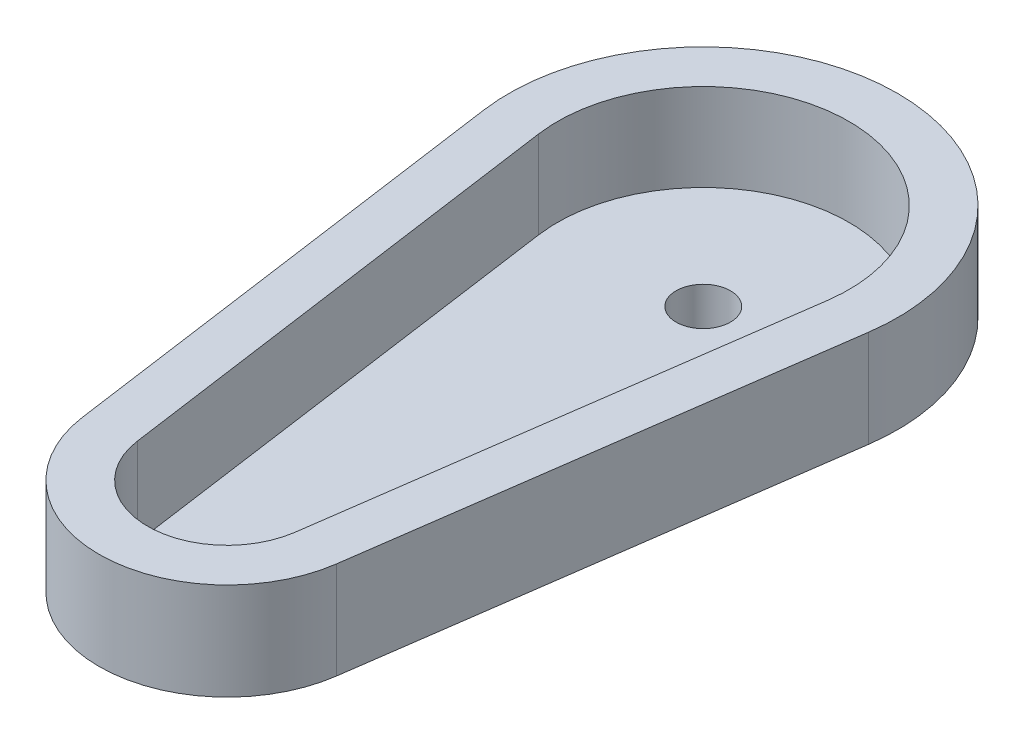
ISO-10303-21;
HEADER;
FILE_DESCRIPTION(('STEP AP214'),'2;1');
FILE_NAME('part.step','',(''),(''),'','','');
FILE_SCHEMA(('AUTOMOTIVE_DESIGN { 1 0 10303 214 1 1 1 1 }'));
ENDSEC;
DATA;
#1=APPLICATION_CONTEXT('core data for automotive mechanical design processes');
#2=APPLICATION_PROTOCOL_DEFINITION('international standard','automotive_design',2000,#1);
#3=PRODUCT_CONTEXT('',#1,'mechanical');
#4=PRODUCT('Part','Part','',(#3));
#5=PRODUCT_RELATED_PRODUCT_CATEGORY('part','',(#4));
#6=PRODUCT_DEFINITION_FORMATION('','',#4);
#7=PRODUCT_DEFINITION_CONTEXT('part definition',#1,'design');
#8=PRODUCT_DEFINITION('design','',#6,#7);
#9=PRODUCT_DEFINITION_SHAPE('','',#8);
#10=(LENGTH_UNIT() NAMED_UNIT(*) SI_UNIT(.MILLI.,.METRE.));
#11=(NAMED_UNIT(*) PLANE_ANGLE_UNIT() SI_UNIT($,.RADIAN.));
#12=(NAMED_UNIT(*) SI_UNIT($,.STERADIAN.) SOLID_ANGLE_UNIT());
#13=UNCERTAINTY_MEASURE_WITH_UNIT(LENGTH_MEASURE(1.E-05),#10,'distance_accuracy_value','');
#14=(GEOMETRIC_REPRESENTATION_CONTEXT(3) GLOBAL_UNCERTAINTY_ASSIGNED_CONTEXT((#13)) GLOBAL_UNIT_ASSIGNED_CONTEXT((#10,
#11,#12)) REPRESENTATION_CONTEXT('',''));
#15=CARTESIAN_POINT('',(0.,0.,0.));
#16=DIRECTION('',(0.,0.,1.));
#17=DIRECTION('',(1.,0.,0.));
#18=AXIS2_PLACEMENT_3D('',#15,#16,#17);
#19=CARTESIAN_POINT('',(0.,2.5,0.));
#20=DIRECTION('',(0.,-1.,0.));
#21=DIRECTION('',(0.,0.,-1.));
#22=AXIS2_PLACEMENT_3D('',#19,#20,#21);
#23=PLANE('',#22);
#24=CARTESIAN_POINT('',(0.,2.5,0.));
#25=DIRECTION('',(0.,1.,0.));
#26=DIRECTION('',(0.,0.,1.));
#27=AXIS2_PLACEMENT_3D('',#24,#25,#26);
#28=CIRCLE('',#27,1.4);
#29=CARTESIAN_POINT('',(0.,2.5,1.4));
#30=VERTEX_POINT('',#29);
#31=EDGE_CURVE('E157',#30,#30,#28,.T.);
#32=ORIENTED_EDGE('',*,*,#31,.F.);
#33=EDGE_LOOP('',(#32));
#34=FACE_BOUND('',#33,.T.);
#35=CARTESIAN_POINT('',(0.,2.5,24.5));
#36=DIRECTION('',(0.,1.,0.));
#37=DIRECTION('',(0.,0.,1.));
#38=AXIS2_PLACEMENT_3D('',#35,#36,#37);
#39=CIRCLE('',#38,1.4);
#40=CARTESIAN_POINT('',(0.,2.5,25.9));
#41=VERTEX_POINT('',#40);
#42=EDGE_CURVE('E160',#41,#41,#39,.T.);
#43=ORIENTED_EDGE('',*,*,#42,.F.);
#44=EDGE_LOOP('',(#43));
#45=FACE_BOUND('',#44,.T.);
#46=CARTESIAN_POINT('',(0.,2.5,0.));
#47=DIRECTION('',(0.,1.,0.));
#48=DIRECTION('',(0.,0.,-1.));
#49=AXIS2_PLACEMENT_3D('',#46,#47,#48);
#50=CIRCLE('',#49,7.5);
#51=CARTESIAN_POINT('',(7.42742898817803,2.5,1.04081632653061));
#52=VERTEX_POINT('',#51);
#53=CARTESIAN_POINT('',(-7.42742898817803,2.5,1.04081632653061));
#54=VERTEX_POINT('',#53);
#55=EDGE_CURVE('E132',#52,#54,#50,.T.);
#56=ORIENTED_EDGE('',*,*,#55,.T.);
#57=DIRECTION('',(0.138775510204082,0.,0.990323865090404));
#58=VECTOR('',#57,1.);
#59=CARTESIAN_POINT('',(-7.42742898817803,2.5,1.04081632653061));
#60=LINE('',#59,#58);
#61=CARTESIAN_POINT('',(-4.06032784687066,2.5,25.0689795918367));
#62=VERTEX_POINT('',#61);
#63=EDGE_CURVE('E207',#54,#62,#60,.T.);
#64=ORIENTED_EDGE('',*,*,#63,.T.);
#65=CARTESIAN_POINT('',(0.,2.5,24.5));
#66=DIRECTION('',(0.,1.,0.));
#67=DIRECTION('',(0.,0.,1.));
#68=AXIS2_PLACEMENT_3D('',#65,#66,#67);
#69=CIRCLE('',#68,4.1);
#70=CARTESIAN_POINT('',(4.06032784687066,2.5,25.0689795918367));
#71=VERTEX_POINT('',#70);
#72=EDGE_CURVE('E211',#62,#71,#69,.T.);
#73=ORIENTED_EDGE('',*,*,#72,.T.);
#74=DIRECTION('',(0.138775510204082,0.,-0.990323865090404));
#75=VECTOR('',#74,1.);
#76=CARTESIAN_POINT('',(7.42742898817803,2.5,1.04081632653061));
#77=LINE('',#76,#75);
#78=EDGE_CURVE('E215',#71,#52,#77,.T.);
#79=ORIENTED_EDGE('',*,*,#78,.T.);
#80=EDGE_LOOP('',(#56,#64,#73,#79));
#81=FACE_BOUND('',#80,.T.);
#82=ADVANCED_FACE('F45',(#34,#45,#81),#23,.F.);
#83=CARTESIAN_POINT('',(0.,7.,0.));
#84=DIRECTION('',(0.,-1.,0.));
#85=DIRECTION('',(0.,0.,-1.));
#86=AXIS2_PLACEMENT_3D('',#83,#84,#85);
#87=CYLINDRICAL_SURFACE('',#86,7.5);
#88=DIRECTION('',(0.,-1.,0.));
#89=VECTOR('',#88,1.);
#90=CARTESIAN_POINT('',(-7.42742898817803,7.,1.04081632653061));
#91=LINE('',#90,#89);
#92=CARTESIAN_POINT('',(-7.42742898817803,7.,1.04081632653061));
#93=VERTEX_POINT('',#92);
#94=EDGE_CURVE('E167',#93,#54,#91,.T.);
#95=ORIENTED_EDGE('',*,*,#94,.T.);
#96=ORIENTED_EDGE('',*,*,#55,.F.);
#97=DIRECTION('',(0.,-1.,0.));
#98=VECTOR('',#97,1.);
#99=CARTESIAN_POINT('',(7.42742898817803,7.,1.04081632653061));
#100=LINE('',#99,#98);
#101=CARTESIAN_POINT('',(7.42742898817803,7.,1.04081632653061));
#102=VERTEX_POINT('',#101);
#103=EDGE_CURVE('E124',#102,#52,#100,.T.);
#104=ORIENTED_EDGE('',*,*,#103,.F.);
#105=CARTESIAN_POINT('',(0.,7.,0.));
#106=DIRECTION('',(0.,-1.,0.));
#107=DIRECTION('',(0.,0.,-1.));
#108=AXIS2_PLACEMENT_3D('',#105,#106,#107);
#109=CIRCLE('',#108,7.5);
#110=EDGE_CURVE('E129',#93,#102,#109,.T.);
#111=ORIENTED_EDGE('',*,*,#110,.F.);
#112=EDGE_LOOP('',(#95,#96,#104,#111));
#113=FACE_BOUND('',#112,.T.);
#114=ADVANCED_FACE('F127',(#113),#87,.F.);
#115=CARTESIAN_POINT('',(-7.42742898817803,7.,1.04081632653061));
#116=DIRECTION('',(-0.990323865090404,0.,0.138775510204082));
#117=DIRECTION('',(0.138775510204082,0.,0.990323865090404));
#118=AXIS2_PLACEMENT_3D('',#115,#116,#117);
#119=PLANE('',#118);
#120=DIRECTION('',(0.,-1.,0.));
#121=VECTOR('',#120,1.);
#122=CARTESIAN_POINT('',(-4.06032784687066,7.,25.0689795918367));
#123=LINE('',#122,#121);
#124=CARTESIAN_POINT('',(-4.06032784687066,7.,25.0689795918367));
#125=VERTEX_POINT('',#124);
#126=EDGE_CURVE('E171',#125,#62,#123,.T.);
#127=ORIENTED_EDGE('',*,*,#126,.T.);
#128=ORIENTED_EDGE('',*,*,#63,.F.);
#129=ORIENTED_EDGE('',*,*,#94,.F.);
#130=DIRECTION('',(-0.138775510204082,0.,-0.990323865090404));
#131=VECTOR('',#130,1.);
#132=CARTESIAN_POINT('',(-7.42742898817803,7.,1.04081632653061));
#133=LINE('',#132,#131);
#134=EDGE_CURVE('E137',#125,#93,#133,.T.);
#135=ORIENTED_EDGE('',*,*,#134,.F.);
#136=EDGE_LOOP('',(#127,#128,#129,#135));
#137=FACE_BOUND('',#136,.T.);
#138=ADVANCED_FACE('F280',(#137),#119,.F.);
#139=CARTESIAN_POINT('',(0.,7.,24.5));
#140=DIRECTION('',(0.,-1.,0.));
#141=DIRECTION('',(0.,0.,-1.));
#142=AXIS2_PLACEMENT_3D('',#139,#140,#141);
#143=CYLINDRICAL_SURFACE('',#142,4.1);
#144=DIRECTION('',(0.,-1.,0.));
#145=VECTOR('',#144,1.);
#146=CARTESIAN_POINT('',(4.06032784687066,7.,25.0689795918367));
#147=LINE('',#146,#145);
#148=CARTESIAN_POINT('',(4.06032784687066,7.,25.0689795918367));
#149=VERTEX_POINT('',#148);
#150=EDGE_CURVE('E136',#149,#71,#147,.T.);
#151=ORIENTED_EDGE('',*,*,#150,.T.);
#152=ORIENTED_EDGE('',*,*,#72,.F.);
#153=ORIENTED_EDGE('',*,*,#126,.F.);
#154=CARTESIAN_POINT('',(0.,7.,24.5));
#155=DIRECTION('',(0.,-1.,0.));
#156=DIRECTION('',(0.,0.,-1.));
#157=AXIS2_PLACEMENT_3D('',#154,#155,#156);
#158=CIRCLE('',#157,4.1);
#159=EDGE_CURVE('E147',#149,#125,#158,.T.);
#160=ORIENTED_EDGE('',*,*,#159,.F.);
#161=EDGE_LOOP('',(#151,#152,#153,#160));
#162=FACE_BOUND('',#161,.T.);
#163=ADVANCED_FACE('F278',(#162),#143,.F.);
#164=CARTESIAN_POINT('',(4.06032784687066,7.,25.0689795918367));
#165=DIRECTION('',(0.990323865090404,0.,0.138775510204082));
#166=DIRECTION('',(0.138775510204082,0.,-0.990323865090404));
#167=AXIS2_PLACEMENT_3D('',#164,#165,#166);
#168=PLANE('',#167);
#169=ORIENTED_EDGE('',*,*,#103,.T.);
#170=ORIENTED_EDGE('',*,*,#78,.F.);
#171=ORIENTED_EDGE('',*,*,#150,.F.);
#172=DIRECTION('',(-0.138775510204082,0.,0.990323865090404));
#173=VECTOR('',#172,1.);
#174=CARTESIAN_POINT('',(4.06032784687066,7.,25.0689795918367));
#175=LINE('',#174,#173);
#176=EDGE_CURVE('E141',#102,#149,#175,.T.);
#177=ORIENTED_EDGE('',*,*,#176,.F.);
#178=EDGE_LOOP('',(#169,#170,#171,#177));
#179=FACE_BOUND('',#178,.T.);
#180=ADVANCED_FACE('F142',(#179),#168,.F.);
#181=CARTESIAN_POINT('',(0.,7.,0.));
#182=DIRECTION('',(0.,-1.,0.));
#183=DIRECTION('',(0.,0.,-1.));
#184=AXIS2_PLACEMENT_3D('',#181,#182,#183);
#185=CYLINDRICAL_SURFACE('',#184,10.);
#186=DIRECTION('',(0.,-1.,0.));
#187=VECTOR('',#186,1.);
#188=CARTESIAN_POINT('',(9.90323865090404,7.,1.38775510204081));
#189=LINE('',#188,#187);
#190=CARTESIAN_POINT('',(9.90323865090404,7.,1.38775510204081));
#191=VERTEX_POINT('',#190);
#192=CARTESIAN_POINT('',(9.90323865090404,2.,1.38775510204081));
#193=VERTEX_POINT('',#192);
#194=EDGE_CURVE('E192',#191,#193,#189,.T.);
#195=ORIENTED_EDGE('',*,*,#194,.T.);
#196=CARTESIAN_POINT('',(0.,2.,0.));
#197=DIRECTION('',(0.,-1.,0.));
#198=DIRECTION('',(0.,0.,-1.));
#199=AXIS2_PLACEMENT_3D('',#196,#197,#198);
#200=CIRCLE('',#199,10.);
#201=CARTESIAN_POINT('',(-9.90323865090404,2.,1.38775510204082));
#202=VERTEX_POINT('',#201);
#203=EDGE_CURVE('E11',#193,#202,#200,.F.);
#204=ORIENTED_EDGE('',*,*,#203,.T.);
#205=DIRECTION('',(0.,-1.,0.));
#206=VECTOR('',#205,1.);
#207=CARTESIAN_POINT('',(-9.90323865090404,7.,1.38775510204082));
#208=LINE('',#207,#206);
#209=CARTESIAN_POINT('',(-9.90323865090404,7.,1.38775510204082));
#210=VERTEX_POINT('',#209);
#211=EDGE_CURVE('E193',#210,#202,#208,.T.);
#212=ORIENTED_EDGE('',*,*,#211,.F.);
#213=CARTESIAN_POINT('',(0.,7.,0.));
#214=DIRECTION('',(0.,-1.,0.));
#215=DIRECTION('',(0.,0.,-1.));
#216=AXIS2_PLACEMENT_3D('',#213,#214,#215);
#217=CIRCLE('',#216,10.);
#218=EDGE_CURVE('E170',#210,#191,#217,.T.);
#219=ORIENTED_EDGE('',*,*,#218,.T.);
#220=EDGE_LOOP('',(#195,#204,#212,#219));
#221=FACE_BOUND('',#220,.T.);
#222=ADVANCED_FACE('F294',(#221),#185,.T.);
#223=CARTESIAN_POINT('',(-6.53613750959667,7.,25.4159183673469));
#224=DIRECTION('',(-0.990323865090404,0.,0.138775510204082));
#225=DIRECTION('',(0.138775510204082,0.,0.990323865090404));
#226=AXIS2_PLACEMENT_3D('',#223,#224,#225);
#227=PLANE('',#226);
#228=ORIENTED_EDGE('',*,*,#211,.T.);
#229=DIRECTION('',(0.138775510204082,0.,0.990323865090404));
#230=VECTOR('',#229,1.);
#231=CARTESIAN_POINT('',(-6.53613750959667,2.,25.4159183673469));
#232=LINE('',#231,#230);
#233=CARTESIAN_POINT('',(-6.53613750959667,2.,25.4159183673469));
#234=VERTEX_POINT('',#233);
#235=EDGE_CURVE('E235',#202,#234,#232,.T.);
#236=ORIENTED_EDGE('',*,*,#235,.T.);
#237=DIRECTION('',(0.,-1.,0.));
#238=VECTOR('',#237,1.);
#239=CARTESIAN_POINT('',(-6.53613750959667,7.,25.4159183673469));
#240=LINE('',#239,#238);
#241=CARTESIAN_POINT('',(-6.53613750959667,7.,25.4159183673469));
#242=VERTEX_POINT('',#241);
#243=EDGE_CURVE('E196',#242,#234,#240,.T.);
#244=ORIENTED_EDGE('',*,*,#243,.F.);
#245=DIRECTION('',(-0.138775510204082,0.,-0.990323865090404));
#246=VECTOR('',#245,1.);
#247=CARTESIAN_POINT('',(-6.53613750959667,7.,25.4159183673469));
#248=LINE('',#247,#246);
#249=EDGE_CURVE('E188',#242,#210,#248,.T.);
#250=ORIENTED_EDGE('',*,*,#249,.T.);
#251=EDGE_LOOP('',(#228,#236,#244,#250));
#252=FACE_BOUND('',#251,.T.);
#253=ADVANCED_FACE('F300',(#252),#227,.T.);
#254=CARTESIAN_POINT('',(0.,7.,24.5));
#255=DIRECTION('',(0.,-1.,0.));
#256=DIRECTION('',(0.,0.,-1.));
#257=AXIS2_PLACEMENT_3D('',#254,#255,#256);
#258=CYLINDRICAL_SURFACE('',#257,6.6);
#259=ORIENTED_EDGE('',*,*,#243,.T.);
#260=CARTESIAN_POINT('',(0.,2.,24.5));
#261=DIRECTION('',(0.,-1.,0.));
#262=DIRECTION('',(0.,0.,-1.));
#263=AXIS2_PLACEMENT_3D('',#260,#261,#262);
#264=CIRCLE('',#263,6.6);
#265=CARTESIAN_POINT('',(6.53613750959667,2.,25.4159183673469));
#266=VERTEX_POINT('',#265);
#267=EDGE_CURVE('E231',#234,#266,#264,.F.);
#268=ORIENTED_EDGE('',*,*,#267,.T.);
#269=DIRECTION('',(0.,-1.,0.));
#270=VECTOR('',#269,1.);
#271=CARTESIAN_POINT('',(6.53613750959667,7.,25.4159183673469));
#272=LINE('',#271,#270);
#273=CARTESIAN_POINT('',(6.53613750959667,7.,25.4159183673469));
#274=VERTEX_POINT('',#273);
#275=EDGE_CURVE('E200',#274,#266,#272,.T.);
#276=ORIENTED_EDGE('',*,*,#275,.F.);
#277=CARTESIAN_POINT('',(0.,7.,24.5));
#278=DIRECTION('',(0.,-1.,0.));
#279=DIRECTION('',(0.,0.,-1.));
#280=AXIS2_PLACEMENT_3D('',#277,#278,#279);
#281=CIRCLE('',#280,6.6);
#282=EDGE_CURVE('E184',#274,#242,#281,.T.);
#283=ORIENTED_EDGE('',*,*,#282,.T.);
#284=EDGE_LOOP('',(#259,#268,#276,#283));
#285=FACE_BOUND('',#284,.T.);
#286=ADVANCED_FACE('F303',(#285),#258,.T.);
#287=CARTESIAN_POINT('',(9.90323865090404,7.,1.38775510204081));
#288=DIRECTION('',(0.990323865090404,0.,0.138775510204082));
#289=DIRECTION('',(0.138775510204082,0.,-0.990323865090404));
#290=AXIS2_PLACEMENT_3D('',#287,#288,#289);
#291=PLANE('',#290);
#292=ORIENTED_EDGE('',*,*,#275,.T.);
#293=DIRECTION('',(0.138775510204082,0.,-0.990323865090404));
#294=VECTOR('',#293,1.);
#295=CARTESIAN_POINT('',(9.90323865090404,2.,1.38775510204081));
#296=LINE('',#295,#294);
#297=EDGE_CURVE('E56',#266,#193,#296,.T.);
#298=ORIENTED_EDGE('',*,*,#297,.T.);
#299=ORIENTED_EDGE('',*,*,#194,.F.);
#300=DIRECTION('',(-0.138775510204082,0.,0.990323865090404));
#301=VECTOR('',#300,1.);
#302=CARTESIAN_POINT('',(9.90323865090404,7.,1.38775510204081));
#303=LINE('',#302,#301);
#304=EDGE_CURVE('E180',#191,#274,#303,.T.);
#305=ORIENTED_EDGE('',*,*,#304,.T.);
#306=EDGE_LOOP('',(#292,#298,#299,#305));
#307=FACE_BOUND('',#306,.T.);
#308=ADVANCED_FACE('F299',(#307),#291,.T.);
#309=CARTESIAN_POINT('',(0.,7.,0.));
#310=DIRECTION('',(0.,-1.,0.));
#311=DIRECTION('',(0.,0.,-1.));
#312=AXIS2_PLACEMENT_3D('',#309,#310,#311);
#313=PLANE('',#312);
#314=ORIENTED_EDGE('',*,*,#134,.T.);
#315=ORIENTED_EDGE('',*,*,#110,.T.);
#316=ORIENTED_EDGE('',*,*,#176,.T.);
#317=ORIENTED_EDGE('',*,*,#159,.T.);
#318=EDGE_LOOP('',(#314,#315,#316,#317));
#319=FACE_BOUND('',#318,.T.);
#320=ORIENTED_EDGE('',*,*,#218,.F.);
#321=ORIENTED_EDGE('',*,*,#249,.F.);
#322=ORIENTED_EDGE('',*,*,#282,.F.);
#323=ORIENTED_EDGE('',*,*,#304,.F.);
#324=EDGE_LOOP('',(#320,#321,#322,#323));
#325=FACE_BOUND('',#324,.T.);
#326=ADVANCED_FACE('F149',(#319,#325),#313,.F.);
#327=CARTESIAN_POINT('',(0.,0.,0.));
#328=DIRECTION('',(0.,-1.,0.));
#329=DIRECTION('',(0.,0.,-1.));
#330=AXIS2_PLACEMENT_3D('',#327,#328,#329);
#331=PLANE('',#330);
#332=DIRECTION('',(-0.138775510204082,0.,0.990323865090404));
#333=VECTOR('',#332,1.);
#334=CARTESIAN_POINT('',(6.47265615033491,0.,0.90702263300129));
#335=LINE('',#334,#333);
#336=CARTESIAN_POINT('',(6.47265615033491,0.,0.907022633001289));
#337=VERTEX_POINT('',#336);
#338=CARTESIAN_POINT('',(3.10555500902753,0.,24.9351858983074));
#339=VERTEX_POINT('',#338);
#340=EDGE_CURVE('E221',#337,#339,#335,.T.);
#341=ORIENTED_EDGE('',*,*,#340,.T.);
#342=CARTESIAN_POINT('',(0.,0.,24.5));
#343=DIRECTION('',(0.,-1.,0.));
#344=DIRECTION('',(0.,0.,-1.));
#345=AXIS2_PLACEMENT_3D('',#342,#343,#344);
#346=CIRCLE('',#345,3.13589838486225);
#347=CARTESIAN_POINT('',(-3.10555500902753,0.,24.9351858983074));
#348=VERTEX_POINT('',#347);
#349=EDGE_CURVE('E227',#339,#348,#346,.T.);
#350=ORIENTED_EDGE('',*,*,#349,.T.);
#351=DIRECTION('',(-0.138775510204082,0.,-0.990323865090404));
#352=VECTOR('',#351,1.);
#353=CARTESIAN_POINT('',(-6.47265615033491,0.,0.907022633001291));
#354=LINE('',#353,#352);
#355=CARTESIAN_POINT('',(-6.47265615033491,0.,0.907022633001293));
#356=VERTEX_POINT('',#355);
#357=EDGE_CURVE('E224',#348,#356,#354,.T.);
#358=ORIENTED_EDGE('',*,*,#357,.T.);
#359=CARTESIAN_POINT('',(0.,0.,0.));
#360=DIRECTION('',(0.,-1.,0.));
#361=DIRECTION('',(0.,0.,-1.));
#362=AXIS2_PLACEMENT_3D('',#359,#360,#361);
#363=CIRCLE('',#362,6.53589838486225);
#364=EDGE_CURVE('E218',#356,#337,#363,.T.);
#365=ORIENTED_EDGE('',*,*,#364,.T.);
#366=EDGE_LOOP('',(#341,#350,#358,#365));
#367=FACE_BOUND('',#366,.T.);
#368=CARTESIAN_POINT('',(0.,0.,0.));
#369=DIRECTION('',(0.,-1.,0.));
#370=DIRECTION('',(0.,0.,-1.));
#371=AXIS2_PLACEMENT_3D('',#368,#369,#370);
#372=CIRCLE('',#371,1.4);
#373=CARTESIAN_POINT('',(0.,0.,1.4));
#374=VERTEX_POINT('',#373);
#375=EDGE_CURVE('E153',#374,#374,#372,.F.);
#376=ORIENTED_EDGE('',*,*,#375,.T.);
#377=EDGE_LOOP('',(#376));
#378=FACE_BOUND('',#377,.T.);
#379=CARTESIAN_POINT('',(0.,0.,24.5));
#380=DIRECTION('',(0.,-1.,0.));
#381=DIRECTION('',(0.,0.,-1.));
#382=AXIS2_PLACEMENT_3D('',#379,#380,#381);
#383=CIRCLE('',#382,1.4);
#384=CARTESIAN_POINT('',(0.,0.,25.9));
#385=VERTEX_POINT('',#384);
#386=EDGE_CURVE('E254',#385,#385,#383,.F.);
#387=ORIENTED_EDGE('',*,*,#386,.T.);
#388=EDGE_LOOP('',(#387));
#389=FACE_BOUND('',#388,.T.);
#390=ADVANCED_FACE('F298',(#367,#378,#389),#331,.T.);
#391=CARTESIAN_POINT('',(0.,-3.95979797464467,24.5));
#392=DIRECTION('',(0.,1.,0.));
#393=DIRECTION('',(0.,0.,1.));
#394=AXIS2_PLACEMENT_3D('',#391,#392,#393);
#395=CYLINDRICAL_SURFACE('',#394,1.4);
#396=CARTESIAN_POINT('',(0.,2.5,25.9));
#397=CARTESIAN_POINT('',(0.,2.47395833333333,25.9));
#398=CARTESIAN_POINT('',(0.,2.44791666666667,25.9));
#399=CARTESIAN_POINT('',(0.,2.39583333333333,25.9));
#400=CARTESIAN_POINT('',(0.,2.36979166666667,25.9));
#401=CARTESIAN_POINT('',(0.,2.31770833333333,25.9));
#402=CARTESIAN_POINT('',(0.,2.29166666666667,25.9));
#403=CARTESIAN_POINT('',(0.,2.23958333333333,25.9));
#404=CARTESIAN_POINT('',(0.,2.21354166666667,25.9));
#405=CARTESIAN_POINT('',(0.,2.16145833333333,25.9));
#406=CARTESIAN_POINT('',(0.,2.13541666666667,25.9));
#407=CARTESIAN_POINT('',(0.,2.08333333333333,25.9));
#408=CARTESIAN_POINT('',(0.,2.05729166666667,25.9));
#409=CARTESIAN_POINT('',(0.,2.00520833333333,25.9));
#410=CARTESIAN_POINT('',(0.,1.97916666666667,25.9));
#411=CARTESIAN_POINT('',(0.,1.92708333333333,25.9));
#412=CARTESIAN_POINT('',(0.,1.90104166666667,25.9));
#413=CARTESIAN_POINT('',(0.,1.84895833333333,25.9));
#414=CARTESIAN_POINT('',(0.,1.82291666666667,25.9));
#415=CARTESIAN_POINT('',(0.,1.77083333333333,25.9));
#416=CARTESIAN_POINT('',(0.,1.74479166666667,25.9));
#417=CARTESIAN_POINT('',(0.,1.69270833333333,25.9));
#418=CARTESIAN_POINT('',(0.,1.66666666666667,25.9));
#419=CARTESIAN_POINT('',(0.,1.61458333333333,25.9));
#420=CARTESIAN_POINT('',(0.,1.58854166666667,25.9));
#421=CARTESIAN_POINT('',(0.,1.53645833333333,25.9));
#422=CARTESIAN_POINT('',(0.,1.51041666666667,25.9));
#423=CARTESIAN_POINT('',(0.,1.45833333333333,25.9));
#424=CARTESIAN_POINT('',(0.,1.43229166666667,25.9));
#425=CARTESIAN_POINT('',(0.,1.38020833333333,25.9));
#426=CARTESIAN_POINT('',(0.,1.35416666666667,25.9));
#427=CARTESIAN_POINT('',(0.,1.30208333333333,25.9));
#428=CARTESIAN_POINT('',(0.,1.27604166666667,25.9));
#429=CARTESIAN_POINT('',(0.,1.22395833333333,25.9));
#430=CARTESIAN_POINT('',(0.,1.19791666666667,25.9));
#431=CARTESIAN_POINT('',(0.,1.14583333333333,25.9));
#432=CARTESIAN_POINT('',(0.,1.11979166666667,25.9));
#433=CARTESIAN_POINT('',(0.,1.06770833333333,25.9));
#434=CARTESIAN_POINT('',(0.,1.04166666666667,25.9));
#435=CARTESIAN_POINT('',(0.,0.989583333333333,25.9));
#436=CARTESIAN_POINT('',(0.,0.963541666666667,25.9));
#437=CARTESIAN_POINT('',(0.,0.911458333333333,25.9));
#438=CARTESIAN_POINT('',(0.,0.885416666666667,25.9));
#439=CARTESIAN_POINT('',(0.,0.833333333333333,25.9));
#440=CARTESIAN_POINT('',(0.,0.807291666666667,25.9));
#441=CARTESIAN_POINT('',(0.,0.755208333333334,25.9));
#442=CARTESIAN_POINT('',(0.,0.729166666666667,25.9));
#443=CARTESIAN_POINT('',(0.,0.677083333333334,25.9));
#444=CARTESIAN_POINT('',(0.,0.651041666666667,25.9));
#445=CARTESIAN_POINT('',(0.,0.598958333333334,25.9));
#446=CARTESIAN_POINT('',(0.,0.572916666666667,25.9));
#447=CARTESIAN_POINT('',(0.,0.520833333333334,25.9));
#448=CARTESIAN_POINT('',(0.,0.494791666666667,25.9));
#449=CARTESIAN_POINT('',(0.,0.442708333333334,25.9));
#450=CARTESIAN_POINT('',(0.,0.416666666666668,25.9));
#451=CARTESIAN_POINT('',(0.,0.364583333333335,25.9));
#452=CARTESIAN_POINT('',(0.,0.338541666666668,25.9));
#453=CARTESIAN_POINT('',(0.,0.286458333333334,25.9));
#454=CARTESIAN_POINT('',(0.,0.260416666666668,25.9));
#455=CARTESIAN_POINT('',(0.,0.208333333333334,25.9));
#456=CARTESIAN_POINT('',(0.,0.182291666666668,25.9));
#457=CARTESIAN_POINT('',(0.,0.130208333333334,25.9));
#458=CARTESIAN_POINT('',(0.,0.104166666666668,25.9));
#459=CARTESIAN_POINT('',(0.,0.0520833333333343,25.9));
#460=CARTESIAN_POINT('',(0.,0.0260416666666676,25.9));
#461=CARTESIAN_POINT('',(0.,0.,25.9));
#462=B_SPLINE_CURVE_WITH_KNOTS('',3,(#396,#397,#398,#399,#400,#401,#402,#403,#404,#405,#406,
#407,#408,#409,#410,#411,#412,#413,#414,#415,#416,#417,#418,#419,#420,#421,#422,#423,#424,#425,
#426,#427,#428,#429,#430,#431,#432,#433,#434,#435,#436,#437,#438,#439,#440,#441,#442,#443,#444,
#445,#446,#447,#448,#449,#450,#451,#452,#453,#454,#455,#456,#457,#458,#459,#460,#461),
.UNSPECIFIED.,.F.,.F.,(4,2,2,2,2,2,2,2,2,2,2,2,2,2,2,2,2,2,2,2,2,2,2,2,2,2,2,2,2,2,2,2,4),(0.,
0.0781250000000001,0.15625,0.234375,0.3125,0.390625,0.46875,0.546875,0.625,0.703125,0.78125,
0.859375,0.937499999999999,1.015625,1.09375,1.171875,1.25,1.328125,1.40625,1.484375,1.5625,
1.640625,1.71875,1.796875,1.875,1.953125,2.03125,2.109375,2.1875,2.265625,2.34375,2.421875,2.5),.UNSPECIFIED.);
#463=EDGE_CURVE('BSEAM290',#41,#385,#462,.T.);
#464=ORIENTED_EDGE('',*,*,#42,.T.);
#465=ORIENTED_EDGE('',*,*,#386,.F.);
#466=ORIENTED_EDGE('',*,*,#463,.T.);
#467=ORIENTED_EDGE('',*,*,#463,.F.);
#468=EDGE_LOOP('',(#464,#466,#465,#467));
#469=FACE_BOUND('',#468,.T.);
#470=ADVANCED_FACE('F290',(#469),#395,.F.);
#471=CARTESIAN_POINT('',(0.,-3.95979797464467,0.));
#472=DIRECTION('',(0.,1.,0.));
#473=DIRECTION('',(0.,0.,1.));
#474=AXIS2_PLACEMENT_3D('',#471,#472,#473);
#475=CYLINDRICAL_SURFACE('',#474,1.4);
#476=CARTESIAN_POINT('',(0.,2.5,1.4));
#477=CARTESIAN_POINT('',(0.,2.47395833333333,1.4));
#478=CARTESIAN_POINT('',(0.,2.44791666666667,1.4));
#479=CARTESIAN_POINT('',(0.,2.39583333333333,1.4));
#480=CARTESIAN_POINT('',(0.,2.36979166666667,1.4));
#481=CARTESIAN_POINT('',(0.,2.31770833333333,1.4));
#482=CARTESIAN_POINT('',(0.,2.29166666666667,1.4));
#483=CARTESIAN_POINT('',(0.,2.23958333333333,1.4));
#484=CARTESIAN_POINT('',(0.,2.21354166666667,1.4));
#485=CARTESIAN_POINT('',(0.,2.16145833333333,1.4));
#486=CARTESIAN_POINT('',(0.,2.13541666666667,1.4));
#487=CARTESIAN_POINT('',(0.,2.08333333333333,1.4));
#488=CARTESIAN_POINT('',(0.,2.05729166666667,1.4));
#489=CARTESIAN_POINT('',(0.,2.00520833333333,1.4));
#490=CARTESIAN_POINT('',(0.,1.97916666666667,1.4));
#491=CARTESIAN_POINT('',(0.,1.92708333333333,1.4));
#492=CARTESIAN_POINT('',(0.,1.90104166666667,1.4));
#493=CARTESIAN_POINT('',(0.,1.84895833333333,1.4));
#494=CARTESIAN_POINT('',(0.,1.82291666666667,1.4));
#495=CARTESIAN_POINT('',(0.,1.77083333333333,1.4));
#496=CARTESIAN_POINT('',(0.,1.74479166666667,1.4));
#497=CARTESIAN_POINT('',(0.,1.69270833333333,1.4));
#498=CARTESIAN_POINT('',(0.,1.66666666666667,1.4));
#499=CARTESIAN_POINT('',(0.,1.61458333333333,1.4));
#500=CARTESIAN_POINT('',(0.,1.58854166666667,1.4));
#501=CARTESIAN_POINT('',(0.,1.53645833333333,1.4));
#502=CARTESIAN_POINT('',(0.,1.51041666666667,1.4));
#503=CARTESIAN_POINT('',(0.,1.45833333333333,1.4));
#504=CARTESIAN_POINT('',(0.,1.43229166666667,1.4));
#505=CARTESIAN_POINT('',(0.,1.38020833333333,1.4));
#506=CARTESIAN_POINT('',(0.,1.35416666666667,1.4));
#507=CARTESIAN_POINT('',(0.,1.30208333333333,1.4));
#508=CARTESIAN_POINT('',(0.,1.27604166666667,1.4));
#509=CARTESIAN_POINT('',(0.,1.22395833333333,1.4));
#510=CARTESIAN_POINT('',(0.,1.19791666666667,1.4));
#511=CARTESIAN_POINT('',(0.,1.14583333333333,1.4));
#512=CARTESIAN_POINT('',(0.,1.11979166666667,1.4));
#513=CARTESIAN_POINT('',(0.,1.06770833333333,1.4));
#514=CARTESIAN_POINT('',(0.,1.04166666666667,1.4));
#515=CARTESIAN_POINT('',(0.,0.989583333333333,1.4));
#516=CARTESIAN_POINT('',(0.,0.963541666666667,1.4));
#517=CARTESIAN_POINT('',(0.,0.911458333333333,1.4));
#518=CARTESIAN_POINT('',(0.,0.885416666666667,1.4));
#519=CARTESIAN_POINT('',(0.,0.833333333333333,1.4));
#520=CARTESIAN_POINT('',(0.,0.807291666666667,1.4));
#521=CARTESIAN_POINT('',(0.,0.755208333333334,1.4));
#522=CARTESIAN_POINT('',(0.,0.729166666666667,1.4));
#523=CARTESIAN_POINT('',(0.,0.677083333333334,1.4));
#524=CARTESIAN_POINT('',(0.,0.651041666666667,1.4));
#525=CARTESIAN_POINT('',(0.,0.598958333333334,1.4));
#526=CARTESIAN_POINT('',(0.,0.572916666666667,1.4));
#527=CARTESIAN_POINT('',(0.,0.520833333333334,1.4));
#528=CARTESIAN_POINT('',(0.,0.494791666666667,1.4));
#529=CARTESIAN_POINT('',(0.,0.442708333333334,1.4));
#530=CARTESIAN_POINT('',(0.,0.416666666666668,1.4));
#531=CARTESIAN_POINT('',(0.,0.364583333333335,1.4));
#532=CARTESIAN_POINT('',(0.,0.338541666666668,1.4));
#533=CARTESIAN_POINT('',(0.,0.286458333333334,1.4));
#534=CARTESIAN_POINT('',(0.,0.260416666666668,1.4));
#535=CARTESIAN_POINT('',(0.,0.208333333333334,1.4));
#536=CARTESIAN_POINT('',(0.,0.182291666666668,1.4));
#537=CARTESIAN_POINT('',(0.,0.130208333333334,1.4));
#538=CARTESIAN_POINT('',(0.,0.104166666666668,1.4));
#539=CARTESIAN_POINT('',(0.,0.0520833333333343,1.4));
#540=CARTESIAN_POINT('',(0.,0.0260416666666676,1.4));
#541=CARTESIAN_POINT('',(0.,0.,1.4));
#542=B_SPLINE_CURVE_WITH_KNOTS('',3,(#476,#477,#478,#479,#480,#481,#482,#483,#484,#485,#486,
#487,#488,#489,#490,#491,#492,#493,#494,#495,#496,#497,#498,#499,#500,#501,#502,#503,#504,#505,
#506,#507,#508,#509,#510,#511,#512,#513,#514,#515,#516,#517,#518,#519,#520,#521,#522,#523,#524,
#525,#526,#527,#528,#529,#530,#531,#532,#533,#534,#535,#536,#537,#538,#539,#540,#541),
.UNSPECIFIED.,.F.,.F.,(4,2,2,2,2,2,2,2,2,2,2,2,2,2,2,2,2,2,2,2,2,2,2,2,2,2,2,2,2,2,2,2,4),(0.,
0.0781250000000001,0.15625,0.234375,0.3125,0.390625,0.46875,0.546875,0.625,0.703125,0.78125,
0.859375,0.937499999999999,1.015625,1.09375,1.171875,1.25,1.328125,1.40625,1.484375,1.5625,
1.640625,1.71875,1.796875,1.875,1.953125,2.03125,2.109375,2.1875,2.265625,2.34375,2.421875,2.5),.UNSPECIFIED.);
#543=EDGE_CURVE('BSEAM269',#30,#374,#542,.T.);
#544=ORIENTED_EDGE('',*,*,#31,.T.);
#545=ORIENTED_EDGE('',*,*,#375,.F.);
#546=ORIENTED_EDGE('',*,*,#543,.T.);
#547=ORIENTED_EDGE('',*,*,#543,.F.);
#548=EDGE_LOOP('',(#544,#546,#545,#547));
#549=FACE_BOUND('',#548,.T.);
#550=ADVANCED_FACE('F269',(#549),#475,.F.);
#551=CARTESIAN_POINT('',(0.,0.,0.));
#552=DIRECTION('',(0.,1.,0.));
#553=DIRECTION('',(0.,0.,1.));
#554=AXIS2_PLACEMENT_3D('',#551,#552,#553);
#555=CONICAL_SURFACE('',#554,6.53589838486224,1.0471975511966);
#556=DIRECTION('',(0.857645625142283,-0.500000000000001,-0.120183117259881));
#557=VECTOR('',#556,1.);
#558=CARTESIAN_POINT('',(-9.90323865090404,2.,1.38775510204082));
#559=LINE('',#558,#557);
#560=EDGE_CURVE('E245',#202,#356,#559,.T.);
#561=ORIENTED_EDGE('',*,*,#560,.F.);
#562=ORIENTED_EDGE('',*,*,#203,.F.);
#563=DIRECTION('',(0.857645625142282,0.500000000000001,0.120183117259881));
#564=VECTOR('',#563,1.);
#565=CARTESIAN_POINT('',(6.47265615033491,0.,0.907022633001289));
#566=LINE('',#565,#564);
#567=EDGE_CURVE('E50',#337,#193,#566,.T.);
#568=ORIENTED_EDGE('',*,*,#567,.F.);
#569=ORIENTED_EDGE('',*,*,#364,.F.);
#570=EDGE_LOOP('',(#561,#562,#568,#569));
#571=FACE_BOUND('',#570,.T.);
#572=ADVANCED_FACE('F48',(#571),#555,.T.);
#573=CARTESIAN_POINT('',(6.47265615033491,0.,0.90702263300129));
#574=DIRECTION('',(-0.495161932545203,0.866025403784438,-0.0693877551020409));
#575=DIRECTION('',(-0.138775510204082,0.,0.990323865090404));
#576=AXIS2_PLACEMENT_3D('',#573,#574,#575);
#577=PLANE('',#576);
#578=ORIENTED_EDGE('',*,*,#567,.T.);
#579=ORIENTED_EDGE('',*,*,#297,.F.);
#580=DIRECTION('',(0.857645625142283,0.500000000000001,0.120183117259882));
#581=VECTOR('',#580,1.);
#582=CARTESIAN_POINT('',(3.10555500902753,0.,24.9351858983074));
#583=LINE('',#582,#581);
#584=EDGE_CURVE('E243',#339,#266,#583,.T.);
#585=ORIENTED_EDGE('',*,*,#584,.F.);
#586=ORIENTED_EDGE('',*,*,#340,.F.);
#587=EDGE_LOOP('',(#578,#579,#585,#586));
#588=FACE_BOUND('',#587,.T.);
#589=ADVANCED_FACE('F328',(#588),#577,.F.);
#590=CARTESIAN_POINT('',(-6.47265615033491,0.,0.907022633001291));
#591=DIRECTION('',(0.495161932545203,0.866025403784438,-0.0693877551020409));
#592=DIRECTION('',(-0.138775510204082,0.,-0.990323865090404));
#593=AXIS2_PLACEMENT_3D('',#590,#591,#592);
#594=PLANE('',#593);
#595=ORIENTED_EDGE('',*,*,#560,.T.);
#596=ORIENTED_EDGE('',*,*,#357,.F.);
#597=DIRECTION('',(0.857645625142283,-0.500000000000001,-0.120183117259881));
#598=VECTOR('',#597,1.);
#599=CARTESIAN_POINT('',(-6.53613750959667,2.,25.4159183673469));
#600=LINE('',#599,#598);
#601=EDGE_CURVE('E240',#234,#348,#600,.T.);
#602=ORIENTED_EDGE('',*,*,#601,.F.);
#603=ORIENTED_EDGE('',*,*,#235,.F.);
#604=EDGE_LOOP('',(#595,#596,#602,#603));
#605=FACE_BOUND('',#604,.T.);
#606=ADVANCED_FACE('F322',(#605),#594,.F.);
#607=CARTESIAN_POINT('',(0.,0.,24.5));
#608=DIRECTION('',(0.,1.,0.));
#609=DIRECTION('',(0.,0.,1.));
#610=AXIS2_PLACEMENT_3D('',#607,#608,#609);
#611=CONICAL_SURFACE('',#610,3.13589838486225,1.0471975511966);
#612=ORIENTED_EDGE('',*,*,#584,.T.);
#613=ORIENTED_EDGE('',*,*,#267,.F.);
#614=ORIENTED_EDGE('',*,*,#601,.T.);
#615=ORIENTED_EDGE('',*,*,#349,.F.);
#616=EDGE_LOOP('',(#612,#613,#614,#615));
#617=FACE_BOUND('',#616,.T.);
#618=ADVANCED_FACE('F316',(#617),#611,.T.);
#619=CLOSED_SHELL('',(#82,#114,#138,#163,#180,#222,#253,#286,#308,#326,#390,#470,#550,#572,#589,
#606,#618));
#620=MANIFOLD_SOLID_BREP('B2',#619);
#621=ADVANCED_BREP_SHAPE_REPRESENTATION('',(#18,#620),#14);
#622=SHAPE_DEFINITION_REPRESENTATION(#9,#621);
ENDSEC;
END-ISO-10303-21;
